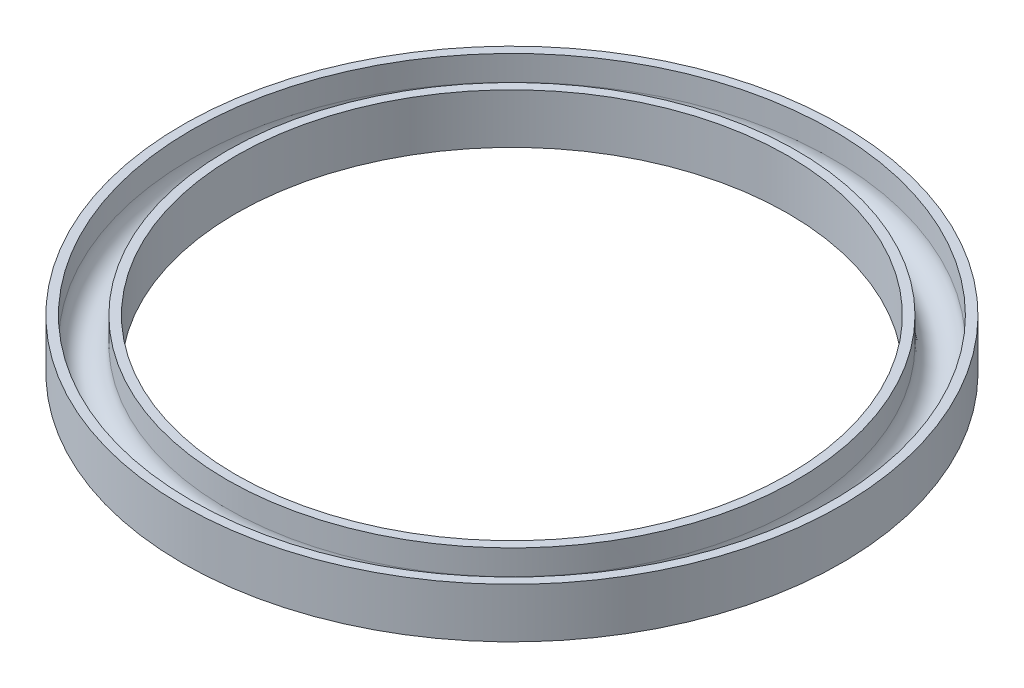
ISO-10303-21;
HEADER;
FILE_DESCRIPTION(('STEP AP214'),'2;1');
FILE_NAME('part.step','',(''),(''),'','','');
FILE_SCHEMA(('AUTOMOTIVE_DESIGN { 1 0 10303 214 1 1 1 1 }'));
ENDSEC;
DATA;
#1=APPLICATION_CONTEXT('core data for automotive mechanical design processes');
#2=APPLICATION_PROTOCOL_DEFINITION('international standard','automotive_design',2000,#1);
#3=PRODUCT_CONTEXT('',#1,'mechanical');
#4=PRODUCT('Part','Part','',(#3));
#5=PRODUCT_RELATED_PRODUCT_CATEGORY('part','',(#4));
#6=PRODUCT_DEFINITION_FORMATION('','',#4);
#7=PRODUCT_DEFINITION_CONTEXT('part definition',#1,'design');
#8=PRODUCT_DEFINITION('design','',#6,#7);
#9=PRODUCT_DEFINITION_SHAPE('','',#8);
#10=(LENGTH_UNIT() NAMED_UNIT(*) SI_UNIT(.MILLI.,.METRE.));
#11=(NAMED_UNIT(*) PLANE_ANGLE_UNIT() SI_UNIT($,.RADIAN.));
#12=(NAMED_UNIT(*) SI_UNIT($,.STERADIAN.) SOLID_ANGLE_UNIT());
#13=UNCERTAINTY_MEASURE_WITH_UNIT(LENGTH_MEASURE(1.E-05),#10,'distance_accuracy_value','');
#14=(GEOMETRIC_REPRESENTATION_CONTEXT(3) GLOBAL_UNCERTAINTY_ASSIGNED_CONTEXT((#13)) GLOBAL_UNIT_ASSIGNED_CONTEXT((#10,
#11,#12)) REPRESENTATION_CONTEXT('',''));
#15=CARTESIAN_POINT('',(0.,0.,0.));
#16=DIRECTION('',(0.,0.,1.));
#17=DIRECTION('',(1.,0.,0.));
#18=AXIS2_PLACEMENT_3D('',#15,#16,#17);
#19=CARTESIAN_POINT('',(0.,0.,0.));
#20=DIRECTION('',(0.,1.,0.));
#21=DIRECTION('',(0.,0.,1.));
#22=AXIS2_PLACEMENT_3D('',#19,#20,#21);
#23=PLANE('',#22);
#24=CARTESIAN_POINT('',(0.,0.,0.));
#25=DIRECTION('',(0.,1.,0.));
#26=DIRECTION('',(0.,0.,1.));
#27=AXIS2_PLACEMENT_3D('',#24,#25,#26);
#28=CIRCLE('',#27,92.5);
#29=CARTESIAN_POINT('',(0.,0.,92.5));
#30=VERTEX_POINT('',#29);
#31=EDGE_CURVE('E83',#30,#30,#28,.T.);
#32=ORIENTED_EDGE('',*,*,#31,.F.);
#33=EDGE_LOOP('',(#32));
#34=FACE_BOUND('',#33,.T.);
#35=CARTESIAN_POINT('',(0.,0.,0.));
#36=DIRECTION('',(0.,1.,0.));
#37=DIRECTION('',(0.,0.,1.));
#38=AXIS2_PLACEMENT_3D('',#35,#36,#37);
#39=CIRCLE('',#38,77.5);
#40=CARTESIAN_POINT('',(0.,0.,77.5));
#41=VERTEX_POINT('',#40);
#42=EDGE_CURVE('E69',#41,#41,#39,.T.);
#43=ORIENTED_EDGE('',*,*,#42,.T.);
#44=EDGE_LOOP('',(#43));
#45=FACE_BOUND('',#44,.T.);
#46=ADVANCED_FACE('F50',(#34,#45),#23,.F.);
#47=CARTESIAN_POINT('',(0.,14.,0.));
#48=DIRECTION('',(0.,-1.,0.));
#49=DIRECTION('',(0.,0.,-1.));
#50=AXIS2_PLACEMENT_3D('',#47,#48,#49);
#51=CYLINDRICAL_SURFACE('',#50,90.);
#52=CARTESIAN_POINT('',(0.,7.,0.));
#53=DIRECTION('',(0.,1.,0.));
#54=DIRECTION('',(0.,0.,1.));
#55=AXIS2_PLACEMENT_3D('',#52,#53,#54);
#56=CIRCLE('',#55,90.);
#57=CARTESIAN_POINT('',(-90.,7.,0.));
#58=VERTEX_POINT('',#57);
#59=EDGE_CURVE('E58',#58,#58,#56,.F.);
#60=ORIENTED_EDGE('',*,*,#59,.T.);
#61=EDGE_LOOP('',(#60));
#62=FACE_BOUND('',#61,.T.);
#63=CARTESIAN_POINT('',(0.,14.,0.));
#64=DIRECTION('',(0.,1.,0.));
#65=DIRECTION('',(0.,0.,1.));
#66=AXIS2_PLACEMENT_3D('',#63,#64,#65);
#67=CIRCLE('',#66,90.);
#68=CARTESIAN_POINT('',(0.,14.,90.));
#69=VERTEX_POINT('',#68);
#70=EDGE_CURVE('E85',#69,#69,#67,.T.);
#71=ORIENTED_EDGE('',*,*,#70,.T.);
#72=EDGE_LOOP('',(#71));
#73=FACE_BOUND('',#72,.T.);
#74=ADVANCED_FACE('F96',(#62,#73),#51,.F.);
#75=CARTESIAN_POINT('',(0.,14.,0.));
#76=DIRECTION('',(0.,-1.,0.));
#77=DIRECTION('',(0.,0.,-1.));
#78=AXIS2_PLACEMENT_3D('',#75,#76,#77);
#79=CYLINDRICAL_SURFACE('',#78,92.5);
#80=CARTESIAN_POINT('',(0.,14.,0.));
#81=DIRECTION('',(0.,1.,0.));
#82=DIRECTION('',(0.,0.,1.));
#83=AXIS2_PLACEMENT_3D('',#80,#81,#82);
#84=CIRCLE('',#83,92.5);
#85=CARTESIAN_POINT('',(0.,14.,92.5));
#86=VERTEX_POINT('',#85);
#87=EDGE_CURVE('E89',#86,#86,#84,.T.);
#88=ORIENTED_EDGE('',*,*,#87,.F.);
#89=EDGE_LOOP('',(#88));
#90=FACE_BOUND('',#89,.T.);
#91=ORIENTED_EDGE('',*,*,#31,.T.);
#92=EDGE_LOOP('',(#91));
#93=FACE_BOUND('',#92,.T.);
#94=ADVANCED_FACE('F99',(#90,#93),#79,.T.);
#95=CARTESIAN_POINT('',(0.,14.,0.));
#96=DIRECTION('',(0.,1.,0.));
#97=DIRECTION('',(0.,0.,1.));
#98=AXIS2_PLACEMENT_3D('',#95,#96,#97);
#99=PLANE('',#98);
#100=ORIENTED_EDGE('',*,*,#70,.F.);
#101=EDGE_LOOP('',(#100));
#102=FACE_BOUND('',#101,.T.);
#103=ORIENTED_EDGE('',*,*,#87,.T.);
#104=EDGE_LOOP('',(#103));
#105=FACE_BOUND('',#104,.T.);
#106=ADVANCED_FACE('F102',(#102,#105),#99,.T.);
#107=CARTESIAN_POINT('',(0.,14.,0.));
#108=DIRECTION('',(0.,-1.,0.));
#109=DIRECTION('',(0.,0.,-1.));
#110=AXIS2_PLACEMENT_3D('',#107,#108,#109);
#111=CYLINDRICAL_SURFACE('',#110,77.5);
#112=CARTESIAN_POINT('',(0.,14.,0.));
#113=DIRECTION('',(0.,1.,0.));
#114=DIRECTION('',(0.,0.,1.));
#115=AXIS2_PLACEMENT_3D('',#112,#113,#114);
#116=CIRCLE('',#115,77.5);
#117=CARTESIAN_POINT('',(0.,14.,77.5));
#118=VERTEX_POINT('',#117);
#119=EDGE_CURVE('E75',#118,#118,#116,.T.);
#120=ORIENTED_EDGE('',*,*,#119,.T.);
#121=EDGE_LOOP('',(#120));
#122=FACE_BOUND('',#121,.T.);
#123=ORIENTED_EDGE('',*,*,#42,.F.);
#124=EDGE_LOOP('',(#123));
#125=FACE_BOUND('',#124,.T.);
#126=ADVANCED_FACE('F105',(#122,#125),#111,.F.);
#127=CARTESIAN_POINT('',(0.,14.,0.));
#128=DIRECTION('',(0.,-1.,0.));
#129=DIRECTION('',(0.,0.,-1.));
#130=AXIS2_PLACEMENT_3D('',#127,#128,#129);
#131=CYLINDRICAL_SURFACE('',#130,80.);
#132=CARTESIAN_POINT('',(0.,7.,0.));
#133=DIRECTION('',(0.,1.,0.));
#134=DIRECTION('',(0.,0.,1.));
#135=AXIS2_PLACEMENT_3D('',#132,#133,#134);
#136=CIRCLE('',#135,80.);
#137=CARTESIAN_POINT('',(-80.,7.,0.));
#138=VERTEX_POINT('',#137);
#139=EDGE_CURVE('E12',#138,#138,#136,.T.);
#140=ORIENTED_EDGE('',*,*,#139,.T.);
#141=EDGE_LOOP('',(#140));
#142=FACE_BOUND('',#141,.T.);
#143=CARTESIAN_POINT('',(0.,14.,0.));
#144=DIRECTION('',(0.,1.,0.));
#145=DIRECTION('',(0.,0.,1.));
#146=AXIS2_PLACEMENT_3D('',#143,#144,#145);
#147=CIRCLE('',#146,80.);
#148=CARTESIAN_POINT('',(0.,14.,80.));
#149=VERTEX_POINT('',#148);
#150=EDGE_CURVE('E81',#149,#149,#147,.T.);
#151=ORIENTED_EDGE('',*,*,#150,.F.);
#152=EDGE_LOOP('',(#151));
#153=FACE_BOUND('',#152,.T.);
#154=ADVANCED_FACE('F119',(#142,#153),#131,.T.);
#155=CARTESIAN_POINT('',(0.,14.,0.));
#156=DIRECTION('',(0.,1.,0.));
#157=DIRECTION('',(0.,0.,1.));
#158=AXIS2_PLACEMENT_3D('',#155,#156,#157);
#159=PLANE('',#158);
#160=ORIENTED_EDGE('',*,*,#119,.F.);
#161=EDGE_LOOP('',(#160));
#162=FACE_BOUND('',#161,.T.);
#163=ORIENTED_EDGE('',*,*,#150,.T.);
#164=EDGE_LOOP('',(#163));
#165=FACE_BOUND('',#164,.T.);
#166=ADVANCED_FACE('F125',(#162,#165),#159,.T.);
#167=CARTESIAN_POINT('',(0.,7.,0.));
#168=DIRECTION('',(0.,1.,0.));
#169=DIRECTION('',(0.,0.,1.));
#170=AXIS2_PLACEMENT_3D('',#167,#168,#169);
#171=TOROIDAL_SURFACE('',#170,85.,4.99999999999998);
#172=CARTESIAN_POINT('',(-85.,7.,0.));
#173=DIRECTION('',(0.,0.,1.));
#174=DIRECTION('',(1.,0.,0.));
#175=AXIS2_PLACEMENT_3D('',#172,#173,#174);
#176=CIRCLE('',#175,4.99999999999998);
#177=EDGE_CURVE('E65',#58,#138,#176,.T.);
#178=ORIENTED_EDGE('',*,*,#177,.T.);
#179=ORIENTED_EDGE('',*,*,#139,.F.);
#180=ORIENTED_EDGE('',*,*,#177,.F.);
#181=ORIENTED_EDGE('',*,*,#59,.F.);
#182=EDGE_LOOP('',(#178,#179,#180,#181));
#183=FACE_BOUND('',#182,.T.);
#184=ADVANCED_FACE('F66',(#183),#171,.F.);
#185=CLOSED_SHELL('',(#46,#74,#94,#106,#126,#154,#166,#184));
#186=MANIFOLD_SOLID_BREP('B2',#185);
#187=ADVANCED_BREP_SHAPE_REPRESENTATION('',(#18,#186),#14);
#188=SHAPE_DEFINITION_REPRESENTATION(#9,#187);
ENDSEC;
END-ISO-10303-21;
